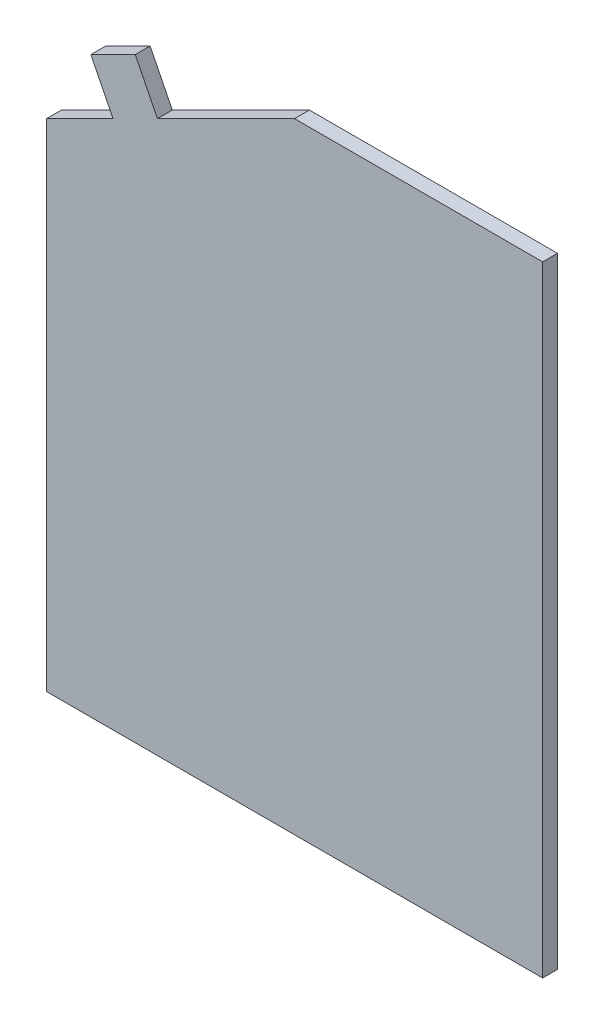
ISO-10303-21;
HEADER;
FILE_DESCRIPTION(('STEP AP214'),'2;1');
FILE_NAME('part.step','',(''),(''),'','','');
FILE_SCHEMA(('AUTOMOTIVE_DESIGN { 1 0 10303 214 1 1 1 1 }'));
ENDSEC;
DATA;
#1=APPLICATION_CONTEXT('core data for automotive mechanical design processes');
#2=APPLICATION_PROTOCOL_DEFINITION('international standard','automotive_design',2000,#1);
#3=PRODUCT_CONTEXT('',#1,'mechanical');
#4=PRODUCT('Part','Part','',(#3));
#5=PRODUCT_RELATED_PRODUCT_CATEGORY('part','',(#4));
#6=PRODUCT_DEFINITION_FORMATION('','',#4);
#7=PRODUCT_DEFINITION_CONTEXT('part definition',#1,'design');
#8=PRODUCT_DEFINITION('design','',#6,#7);
#9=PRODUCT_DEFINITION_SHAPE('','',#8);
#10=(LENGTH_UNIT() NAMED_UNIT(*) SI_UNIT(.MILLI.,.METRE.));
#11=(NAMED_UNIT(*) PLANE_ANGLE_UNIT() SI_UNIT($,.RADIAN.));
#12=(NAMED_UNIT(*) SI_UNIT($,.STERADIAN.) SOLID_ANGLE_UNIT());
#13=UNCERTAINTY_MEASURE_WITH_UNIT(LENGTH_MEASURE(1.E-05),#10,'distance_accuracy_value','');
#14=(GEOMETRIC_REPRESENTATION_CONTEXT(3) GLOBAL_UNCERTAINTY_ASSIGNED_CONTEXT((#13)) GLOBAL_UNIT_ASSIGNED_CONTEXT((#10,
#11,#12)) REPRESENTATION_CONTEXT('',''));
#15=CARTESIAN_POINT('',(0.,0.,0.));
#16=DIRECTION('',(0.,0.,1.));
#17=DIRECTION('',(1.,0.,0.));
#18=AXIS2_PLACEMENT_3D('',#15,#16,#17);
#19=CARTESIAN_POINT('',(0.,0.,3.));
#20=DIRECTION('',(1.,0.,0.));
#21=DIRECTION('',(0.,0.,-1.));
#22=AXIS2_PLACEMENT_3D('',#19,#20,#21);
#23=PLANE('',#22);
#24=DIRECTION('',(0.,-1.,0.));
#25=VECTOR('',#24,1.);
#26=CARTESIAN_POINT('',(0.,0.,0.));
#27=LINE('',#26,#25);
#28=CARTESIAN_POINT('',(0.,100.,0.));
#29=VERTEX_POINT('',#28);
#30=CARTESIAN_POINT('',(0.,0.,0.));
#31=VERTEX_POINT('',#30);
#32=EDGE_CURVE('E139',#29,#31,#27,.T.);
#33=ORIENTED_EDGE('',*,*,#32,.T.);
#34=DIRECTION('',(0.,0.,-1.));
#35=VECTOR('',#34,1.);
#36=CARTESIAN_POINT('',(0.,0.,3.));
#37=LINE('',#36,#35);
#38=CARTESIAN_POINT('',(0.,0.,3.));
#39=VERTEX_POINT('',#38);
#40=EDGE_CURVE('E11',#39,#31,#37,.T.);
#41=ORIENTED_EDGE('',*,*,#40,.F.);
#42=DIRECTION('',(0.,-1.,0.));
#43=VECTOR('',#42,1.);
#44=CARTESIAN_POINT('',(0.,0.,3.));
#45=LINE('',#44,#43);
#46=CARTESIAN_POINT('',(0.,100.,3.));
#47=VERTEX_POINT('',#46);
#48=EDGE_CURVE('E155',#47,#39,#45,.T.);
#49=ORIENTED_EDGE('',*,*,#48,.F.);
#50=DIRECTION('',(0.,0.,-1.));
#51=VECTOR('',#50,1.);
#52=CARTESIAN_POINT('',(0.,100.,3.));
#53=LINE('',#52,#51);
#54=EDGE_CURVE('E135',#47,#29,#53,.T.);
#55=ORIENTED_EDGE('',*,*,#54,.T.);
#56=EDGE_LOOP('',(#33,#41,#49,#55));
#57=FACE_BOUND('',#56,.T.);
#58=ADVANCED_FACE('F37',(#57),#23,.F.);
#59=CARTESIAN_POINT('',(0.,0.,3.));
#60=DIRECTION('',(0.,1.,0.));
#61=DIRECTION('',(0.,0.,1.));
#62=AXIS2_PLACEMENT_3D('',#59,#60,#61);
#63=PLANE('',#62);
#64=DIRECTION('',(1.,0.,0.));
#65=VECTOR('',#64,1.);
#66=CARTESIAN_POINT('',(0.,0.,0.));
#67=LINE('',#66,#65);
#68=CARTESIAN_POINT('',(100.,0.,0.));
#69=VERTEX_POINT('',#68);
#70=EDGE_CURVE('E142',#31,#69,#67,.T.);
#71=ORIENTED_EDGE('',*,*,#70,.T.);
#72=DIRECTION('',(0.,0.,-1.));
#73=VECTOR('',#72,1.);
#74=CARTESIAN_POINT('',(100.,0.,3.));
#75=LINE('',#74,#73);
#76=CARTESIAN_POINT('',(100.,0.,3.));
#77=VERTEX_POINT('',#76);
#78=EDGE_CURVE('E45',#77,#69,#75,.T.);
#79=ORIENTED_EDGE('',*,*,#78,.F.);
#80=DIRECTION('',(1.,0.,0.));
#81=VECTOR('',#80,1.);
#82=CARTESIAN_POINT('',(0.,0.,3.));
#83=LINE('',#82,#81);
#84=EDGE_CURVE('E99',#39,#77,#83,.T.);
#85=ORIENTED_EDGE('',*,*,#84,.F.);
#86=ORIENTED_EDGE('',*,*,#40,.T.);
#87=EDGE_LOOP('',(#71,#79,#85,#86));
#88=FACE_BOUND('',#87,.T.);
#89=ADVANCED_FACE('F198',(#88),#63,.F.);
#90=CARTESIAN_POINT('',(100.,125.,3.));
#91=DIRECTION('',(-1.,0.,0.));
#92=DIRECTION('',(0.,-1.,0.));
#93=AXIS2_PLACEMENT_3D('',#90,#91,#92);
#94=PLANE('',#93);
#95=DIRECTION('',(0.,1.,0.));
#96=VECTOR('',#95,1.);
#97=CARTESIAN_POINT('',(100.,125.,0.));
#98=LINE('',#97,#96);
#99=CARTESIAN_POINT('',(100.,125.,0.));
#100=VERTEX_POINT('',#99);
#101=EDGE_CURVE('E144',#69,#100,#98,.T.);
#102=ORIENTED_EDGE('',*,*,#101,.T.);
#103=DIRECTION('',(0.,0.,-1.));
#104=VECTOR('',#103,1.);
#105=CARTESIAN_POINT('',(100.,125.,3.));
#106=LINE('',#105,#104);
#107=CARTESIAN_POINT('',(100.,125.,3.));
#108=VERTEX_POINT('',#107);
#109=EDGE_CURVE('E165',#108,#100,#106,.T.);
#110=ORIENTED_EDGE('',*,*,#109,.F.);
#111=DIRECTION('',(0.,1.,0.));
#112=VECTOR('',#111,1.);
#113=CARTESIAN_POINT('',(100.,125.,3.));
#114=LINE('',#113,#112);
#115=EDGE_CURVE('E173',#77,#108,#114,.T.);
#116=ORIENTED_EDGE('',*,*,#115,.F.);
#117=ORIENTED_EDGE('',*,*,#78,.T.);
#118=EDGE_LOOP('',(#102,#110,#116,#117));
#119=FACE_BOUND('',#118,.T.);
#120=ADVANCED_FACE('F171',(#119),#94,.F.);
#121=CARTESIAN_POINT('',(50.,125.,3.));
#122=DIRECTION('',(0.,-1.,0.));
#123=DIRECTION('',(0.,0.,-1.));
#124=AXIS2_PLACEMENT_3D('',#121,#122,#123);
#125=PLANE('',#124);
#126=DIRECTION('',(-1.,0.,0.));
#127=VECTOR('',#126,1.);
#128=CARTESIAN_POINT('',(50.,125.,0.));
#129=LINE('',#128,#127);
#130=CARTESIAN_POINT('',(50.,125.,0.));
#131=VERTEX_POINT('',#130);
#132=EDGE_CURVE('E146',#100,#131,#129,.T.);
#133=ORIENTED_EDGE('',*,*,#132,.T.);
#134=DIRECTION('',(0.,0.,-1.));
#135=VECTOR('',#134,1.);
#136=CARTESIAN_POINT('',(50.,125.,3.));
#137=LINE('',#136,#135);
#138=CARTESIAN_POINT('',(50.,125.,3.));
#139=VERTEX_POINT('',#138);
#140=EDGE_CURVE('E162',#139,#131,#137,.T.);
#141=ORIENTED_EDGE('',*,*,#140,.F.);
#142=DIRECTION('',(-1.,0.,0.));
#143=VECTOR('',#142,1.);
#144=CARTESIAN_POINT('',(50.,125.,3.));
#145=LINE('',#144,#143);
#146=EDGE_CURVE('E189',#108,#139,#145,.T.);
#147=ORIENTED_EDGE('',*,*,#146,.F.);
#148=ORIENTED_EDGE('',*,*,#109,.T.);
#149=EDGE_LOOP('',(#133,#141,#147,#148));
#150=FACE_BOUND('',#149,.T.);
#151=ADVANCED_FACE('F182',(#150),#125,.F.);
#152=CARTESIAN_POINT('',(22.3606797749979,111.180339887499,3.));
#153=DIRECTION('',(0.447213595499958,-0.894427190999916,0.));
#154=DIRECTION('',(0.894427190999916,0.447213595499958,0.));
#155=AXIS2_PLACEMENT_3D('',#152,#153,#154);
#156=PLANE('',#155);
#157=DIRECTION('',(-0.894427190999916,-0.447213595499958,0.));
#158=VECTOR('',#157,1.);
#159=CARTESIAN_POINT('',(22.3606797749979,111.180339887499,0.));
#160=LINE('',#159,#158);
#161=CARTESIAN_POINT('',(22.3606797749979,111.180339887499,0.));
#162=VERTEX_POINT('',#161);
#163=EDGE_CURVE('E148',#131,#162,#160,.T.);
#164=ORIENTED_EDGE('',*,*,#163,.T.);
#165=DIRECTION('',(0.,0.,-1.));
#166=VECTOR('',#165,1.);
#167=CARTESIAN_POINT('',(22.3606797749979,111.180339887499,3.));
#168=LINE('',#167,#166);
#169=CARTESIAN_POINT('',(22.3606797749979,111.180339887499,3.));
#170=VERTEX_POINT('',#169);
#171=EDGE_CURVE('E159',#170,#162,#168,.T.);
#172=ORIENTED_EDGE('',*,*,#171,.F.);
#173=DIRECTION('',(-0.894427190999916,-0.447213595499958,0.));
#174=VECTOR('',#173,1.);
#175=CARTESIAN_POINT('',(22.3606797749979,111.180339887499,3.));
#176=LINE('',#175,#174);
#177=EDGE_CURVE('E188',#139,#170,#176,.T.);
#178=ORIENTED_EDGE('',*,*,#177,.F.);
#179=ORIENTED_EDGE('',*,*,#140,.T.);
#180=EDGE_LOOP('',(#164,#172,#178,#179));
#181=FACE_BOUND('',#180,.T.);
#182=ADVANCED_FACE('F186',(#181),#156,.F.);
#183=CARTESIAN_POINT('',(22.3606797749979,111.180339887499,3.));
#184=DIRECTION('',(-0.894427190999915,-0.447213595499959,0.));
#185=DIRECTION('',(0.44721359549996,-0.894427190999915,0.));
#186=AXIS2_PLACEMENT_3D('',#183,#184,#185);
#187=PLANE('',#186);
#188=DIRECTION('',(-0.44721359549996,0.894427190999915,0.));
#189=VECTOR('',#188,1.);
#190=CARTESIAN_POINT('',(22.3606797749979,111.180339887499,0.));
#191=LINE('',#190,#189);
#192=CARTESIAN_POINT('',(17.8885438199983,120.124611797498,0.));
#193=VERTEX_POINT('',#192);
#194=EDGE_CURVE('E150',#162,#193,#191,.T.);
#195=ORIENTED_EDGE('',*,*,#194,.T.);
#196=DIRECTION('',(0.,0.,-1.));
#197=VECTOR('',#196,1.);
#198=CARTESIAN_POINT('',(17.8885438199983,120.124611797498,3.));
#199=LINE('',#198,#197);
#200=CARTESIAN_POINT('',(17.8885438199983,120.124611797498,3.));
#201=VERTEX_POINT('',#200);
#202=EDGE_CURVE('E130',#201,#193,#199,.T.);
#203=ORIENTED_EDGE('',*,*,#202,.F.);
#204=DIRECTION('',(-0.44721359549996,0.894427190999915,0.));
#205=VECTOR('',#204,1.);
#206=CARTESIAN_POINT('',(22.3606797749979,111.180339887499,3.));
#207=LINE('',#206,#205);
#208=EDGE_CURVE('E121',#170,#201,#207,.T.);
#209=ORIENTED_EDGE('',*,*,#208,.F.);
#210=ORIENTED_EDGE('',*,*,#171,.T.);
#211=EDGE_LOOP('',(#195,#203,#209,#210));
#212=FACE_BOUND('',#211,.T.);
#213=ADVANCED_FACE('F210',(#212),#187,.F.);
#214=CARTESIAN_POINT('',(17.8885438199983,120.124611797498,3.));
#215=DIRECTION('',(0.447213595499958,-0.894427190999916,0.));
#216=DIRECTION('',(0.894427190999916,0.447213595499958,0.));
#217=AXIS2_PLACEMENT_3D('',#214,#215,#216);
#218=PLANE('',#217);
#219=DIRECTION('',(-0.894427190999916,-0.447213595499958,0.));
#220=VECTOR('',#219,1.);
#221=CARTESIAN_POINT('',(17.8885438199983,120.124611797498,0.));
#222=LINE('',#221,#220);
#223=CARTESIAN_POINT('',(8.94427190999916,115.652475842499,0.));
#224=VERTEX_POINT('',#223);
#225=EDGE_CURVE('E129',#193,#224,#222,.T.);
#226=ORIENTED_EDGE('',*,*,#225,.T.);
#227=DIRECTION('',(0.,0.,-1.));
#228=VECTOR('',#227,1.);
#229=CARTESIAN_POINT('',(8.94427190999916,115.652475842499,3.));
#230=LINE('',#229,#228);
#231=CARTESIAN_POINT('',(8.94427190999916,115.652475842499,3.));
#232=VERTEX_POINT('',#231);
#233=EDGE_CURVE('E126',#232,#224,#230,.T.);
#234=ORIENTED_EDGE('',*,*,#233,.F.);
#235=DIRECTION('',(-0.894427190999916,-0.447213595499958,0.));
#236=VECTOR('',#235,1.);
#237=CARTESIAN_POINT('',(17.8885438199983,120.124611797498,3.));
#238=LINE('',#237,#236);
#239=EDGE_CURVE('E115',#201,#232,#238,.T.);
#240=ORIENTED_EDGE('',*,*,#239,.F.);
#241=ORIENTED_EDGE('',*,*,#202,.T.);
#242=EDGE_LOOP('',(#226,#234,#240,#241));
#243=FACE_BOUND('',#242,.T.);
#244=ADVANCED_FACE('F127',(#243),#218,.F.);
#245=CARTESIAN_POINT('',(13.4164078649987,106.708203932499,3.));
#246=DIRECTION('',(0.894427190999916,0.447213595499959,0.));
#247=DIRECTION('',(-0.447213595499959,0.894427190999916,0.));
#248=AXIS2_PLACEMENT_3D('',#245,#246,#247);
#249=PLANE('',#248);
#250=DIRECTION('',(0.447213595499958,-0.894427190999916,0.));
#251=VECTOR('',#250,1.);
#252=CARTESIAN_POINT('',(13.4164078649987,106.708203932499,0.));
#253=LINE('',#252,#251);
#254=CARTESIAN_POINT('',(13.4164078649987,106.708203932499,0.));
#255=VERTEX_POINT('',#254);
#256=EDGE_CURVE('E85',#224,#255,#253,.T.);
#257=ORIENTED_EDGE('',*,*,#256,.T.);
#258=DIRECTION('',(0.,0.,-1.));
#259=VECTOR('',#258,1.);
#260=CARTESIAN_POINT('',(13.4164078649987,106.708203932499,3.));
#261=LINE('',#260,#259);
#262=CARTESIAN_POINT('',(13.4164078649987,106.708203932499,3.));
#263=VERTEX_POINT('',#262);
#264=EDGE_CURVE('E131',#263,#255,#261,.T.);
#265=ORIENTED_EDGE('',*,*,#264,.F.);
#266=DIRECTION('',(0.447213595499958,-0.894427190999916,0.));
#267=VECTOR('',#266,1.);
#268=CARTESIAN_POINT('',(13.4164078649987,106.708203932499,3.));
#269=LINE('',#268,#267);
#270=EDGE_CURVE('E119',#232,#263,#269,.T.);
#271=ORIENTED_EDGE('',*,*,#270,.F.);
#272=ORIENTED_EDGE('',*,*,#233,.T.);
#273=EDGE_LOOP('',(#257,#265,#271,#272));
#274=FACE_BOUND('',#273,.T.);
#275=ADVANCED_FACE('F133',(#274),#249,.F.);
#276=CARTESIAN_POINT('',(0.,100.,3.));
#277=DIRECTION('',(0.447213595499958,-0.894427190999916,0.));
#278=DIRECTION('',(0.894427190999916,0.447213595499958,0.));
#279=AXIS2_PLACEMENT_3D('',#276,#277,#278);
#280=PLANE('',#279);
#281=DIRECTION('',(-0.894427190999916,-0.447213595499958,0.));
#282=VECTOR('',#281,1.);
#283=CARTESIAN_POINT('',(0.,100.,0.));
#284=LINE('',#283,#282);
#285=EDGE_CURVE('E91',#255,#29,#284,.T.);
#286=ORIENTED_EDGE('',*,*,#285,.T.);
#287=ORIENTED_EDGE('',*,*,#54,.F.);
#288=DIRECTION('',(-0.894427190999916,-0.447213595499958,0.));
#289=VECTOR('',#288,1.);
#290=CARTESIAN_POINT('',(0.,100.,3.));
#291=LINE('',#290,#289);
#292=EDGE_CURVE('E53',#263,#47,#291,.T.);
#293=ORIENTED_EDGE('',*,*,#292,.F.);
#294=ORIENTED_EDGE('',*,*,#264,.T.);
#295=EDGE_LOOP('',(#286,#287,#293,#294));
#296=FACE_BOUND('',#295,.T.);
#297=ADVANCED_FACE('F218',(#296),#280,.F.);
#298=CARTESIAN_POINT('',(0.,0.,3.));
#299=DIRECTION('',(0.,0.,-1.));
#300=DIRECTION('',(-1.,0.,0.));
#301=AXIS2_PLACEMENT_3D('',#298,#299,#300);
#302=PLANE('',#301);
#303=ORIENTED_EDGE('',*,*,#48,.T.);
#304=ORIENTED_EDGE('',*,*,#84,.T.);
#305=ORIENTED_EDGE('',*,*,#115,.T.);
#306=ORIENTED_EDGE('',*,*,#146,.T.);
#307=ORIENTED_EDGE('',*,*,#177,.T.);
#308=ORIENTED_EDGE('',*,*,#208,.T.);
#309=ORIENTED_EDGE('',*,*,#239,.T.);
#310=ORIENTED_EDGE('',*,*,#270,.T.);
#311=ORIENTED_EDGE('',*,*,#292,.T.);
#312=EDGE_LOOP('',(#303,#304,#305,#306,#307,#308,#309,#310,#311));
#313=FACE_BOUND('',#312,.T.);
#314=ADVANCED_FACE('F117',(#313),#302,.F.);
#315=CARTESIAN_POINT('',(0.,0.,0.));
#316=DIRECTION('',(0.,0.,-1.));
#317=DIRECTION('',(-1.,0.,0.));
#318=AXIS2_PLACEMENT_3D('',#315,#316,#317);
#319=PLANE('',#318);
#320=ORIENTED_EDGE('',*,*,#32,.F.);
#321=ORIENTED_EDGE('',*,*,#285,.F.);
#322=ORIENTED_EDGE('',*,*,#256,.F.);
#323=ORIENTED_EDGE('',*,*,#225,.F.);
#324=ORIENTED_EDGE('',*,*,#194,.F.);
#325=ORIENTED_EDGE('',*,*,#163,.F.);
#326=ORIENTED_EDGE('',*,*,#132,.F.);
#327=ORIENTED_EDGE('',*,*,#101,.F.);
#328=ORIENTED_EDGE('',*,*,#70,.F.);
#329=EDGE_LOOP('',(#320,#321,#322,#323,#324,#325,#326,#327,#328));
#330=FACE_BOUND('',#329,.T.);
#331=ADVANCED_FACE('F177',(#330),#319,.T.);
#332=CLOSED_SHELL('',(#58,#89,#120,#151,#182,#213,#244,#275,#297,#314,#331));
#333=MANIFOLD_SOLID_BREP('B2',#332);
#334=ADVANCED_BREP_SHAPE_REPRESENTATION('',(#18,#333),#14);
#335=SHAPE_DEFINITION_REPRESENTATION(#9,#334);
ENDSEC;
END-ISO-10303-21;
